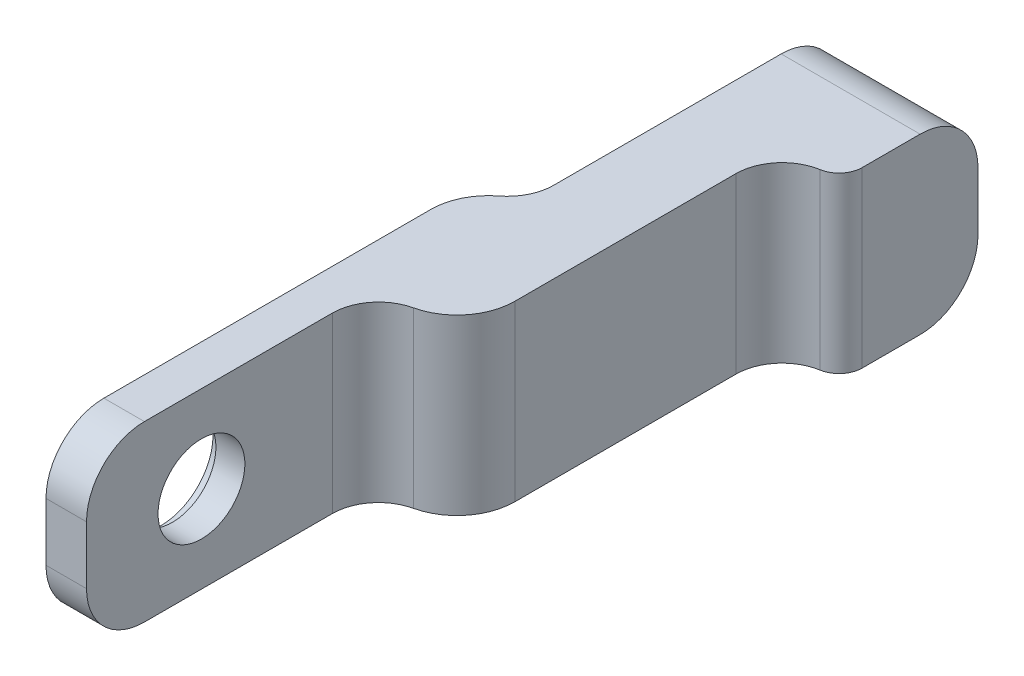
ISO-10303-21;
HEADER;
FILE_DESCRIPTION(('STEP AP214'),'2;1');
FILE_NAME('part.step','',(''),(''),'','','');
FILE_SCHEMA(('AUTOMOTIVE_DESIGN { 1 0 10303 214 1 1 1 1 }'));
ENDSEC;
DATA;
#1=APPLICATION_CONTEXT('core data for automotive mechanical design processes');
#2=APPLICATION_PROTOCOL_DEFINITION('international standard','automotive_design',2000,#1);
#3=PRODUCT_CONTEXT('',#1,'mechanical');
#4=PRODUCT('Part','Part','',(#3));
#5=PRODUCT_RELATED_PRODUCT_CATEGORY('part','',(#4));
#6=PRODUCT_DEFINITION_FORMATION('','',#4);
#7=PRODUCT_DEFINITION_CONTEXT('part definition',#1,'design');
#8=PRODUCT_DEFINITION('design','',#6,#7);
#9=PRODUCT_DEFINITION_SHAPE('','',#8);
#10=(LENGTH_UNIT() NAMED_UNIT(*) SI_UNIT(.MILLI.,.METRE.));
#11=(NAMED_UNIT(*) PLANE_ANGLE_UNIT() SI_UNIT($,.RADIAN.));
#12=(NAMED_UNIT(*) SI_UNIT($,.STERADIAN.) SOLID_ANGLE_UNIT());
#13=UNCERTAINTY_MEASURE_WITH_UNIT(LENGTH_MEASURE(1.E-05),#10,'distance_accuracy_value','');
#14=(GEOMETRIC_REPRESENTATION_CONTEXT(3) GLOBAL_UNCERTAINTY_ASSIGNED_CONTEXT((#13)) GLOBAL_UNIT_ASSIGNED_CONTEXT((#10,
#11,#12)) REPRESENTATION_CONTEXT('',''));
#15=CARTESIAN_POINT('',(0.,0.,0.));
#16=DIRECTION('',(0.,0.,1.));
#17=DIRECTION('',(1.,0.,0.));
#18=AXIS2_PLACEMENT_3D('',#15,#16,#17);
#19=CARTESIAN_POINT('',(12.,-4.,0.));
#20=DIRECTION('',(-1.,0.,0.));
#21=DIRECTION('',(0.,0.,1.));
#22=AXIS2_PLACEMENT_3D('',#19,#20,#21);
#23=PLANE('',#22);
#24=DIRECTION('',(0.,0.,1.));
#25=VECTOR('',#24,1.);
#26=CARTESIAN_POINT('',(12.,11.,0.));
#27=LINE('',#26,#25);
#28=CARTESIAN_POINT('',(12.,11.,0.));
#29=VERTEX_POINT('',#28);
#30=CARTESIAN_POINT('',(12.,11.,5.));
#31=VERTEX_POINT('',#30);
#32=EDGE_CURVE('E255',#29,#31,#27,.T.);
#33=ORIENTED_EDGE('',*,*,#32,.T.);
#34=DIRECTION('',(0.,1.,0.));
#35=VECTOR('',#34,1.);
#36=CARTESIAN_POINT('',(12.,-4.,5.));
#37=LINE('',#36,#35);
#38=CARTESIAN_POINT('',(12.,-4.,5.));
#39=VERTEX_POINT('',#38);
#40=EDGE_CURVE('E347',#31,#39,#37,.F.);
#41=ORIENTED_EDGE('',*,*,#40,.T.);
#42=DIRECTION('',(0.,0.,1.));
#43=VECTOR('',#42,1.);
#44=CARTESIAN_POINT('',(12.,-4.,0.));
#45=LINE('',#44,#43);
#46=CARTESIAN_POINT('',(12.,-4.,0.));
#47=VERTEX_POINT('',#46);
#48=EDGE_CURVE('E268',#47,#39,#45,.T.);
#49=ORIENTED_EDGE('',*,*,#48,.F.);
#50=CARTESIAN_POINT('',(12.,1.,0.));
#51=DIRECTION('',(-1.,0.,0.));
#52=DIRECTION('',(0.,0.,1.));
#53=AXIS2_PLACEMENT_3D('',#50,#51,#52);
#54=CIRCLE('',#53,5.);
#55=CARTESIAN_POINT('',(12.,1.,-5.));
#56=VERTEX_POINT('',#55);
#57=EDGE_CURVE('E302',#47,#56,#54,.F.);
#58=ORIENTED_EDGE('',*,*,#57,.T.);
#59=DIRECTION('',(0.,1.,0.));
#60=VECTOR('',#59,1.);
#61=CARTESIAN_POINT('',(12.,-4.,-5.));
#62=LINE('',#61,#60);
#63=CARTESIAN_POINT('',(12.,6.,-5.));
#64=VERTEX_POINT('',#63);
#65=EDGE_CURVE('E282',#56,#64,#62,.T.);
#66=ORIENTED_EDGE('',*,*,#65,.T.);
#67=CARTESIAN_POINT('',(12.,6.,0.));
#68=DIRECTION('',(-1.,0.,0.));
#69=DIRECTION('',(0.,0.,1.));
#70=AXIS2_PLACEMENT_3D('',#67,#68,#69);
#71=CIRCLE('',#70,5.);
#72=EDGE_CURVE('E300',#64,#29,#71,.F.);
#73=ORIENTED_EDGE('',*,*,#72,.T.);
#74=EDGE_LOOP('',(#33,#41,#49,#58,#66,#73));
#75=FACE_BOUND('',#74,.T.);
#76=ADVANCED_FACE('F53',(#75),#23,.F.);
#77=CARTESIAN_POINT('',(7.,-4.,0.));
#78=DIRECTION('',(1.,0.,0.));
#79=DIRECTION('',(0.,0.,-1.));
#80=AXIS2_PLACEMENT_3D('',#77,#78,#79);
#81=PLANE('',#80);
#82=DIRECTION('',(0.,0.,-1.));
#83=VECTOR('',#82,1.);
#84=CARTESIAN_POINT('',(7.,-4.,0.));
#85=LINE('',#84,#83);
#86=CARTESIAN_POINT('',(7.,-4.,30.));
#87=VERTEX_POINT('',#86);
#88=CARTESIAN_POINT('',(7.,-4.,10.9160797830996));
#89=VERTEX_POINT('',#88);
#90=EDGE_CURVE('E279',#87,#89,#85,.T.);
#91=ORIENTED_EDGE('',*,*,#90,.T.);
#92=DIRECTION('',(0.,-1.,0.));
#93=VECTOR('',#92,1.);
#94=CARTESIAN_POINT('',(7.,11.,10.9160797830996));
#95=LINE('',#94,#93);
#96=CARTESIAN_POINT('',(7.,11.,10.9160797830996));
#97=VERTEX_POINT('',#96);
#98=EDGE_CURVE('E352',#89,#97,#95,.F.);
#99=ORIENTED_EDGE('',*,*,#98,.T.);
#100=DIRECTION('',(0.,0.,-1.));
#101=VECTOR('',#100,1.);
#102=CARTESIAN_POINT('',(7.,11.,0.));
#103=LINE('',#102,#101);
#104=CARTESIAN_POINT('',(7.,11.,30.));
#105=VERTEX_POINT('',#104);
#106=EDGE_CURVE('E265',#105,#97,#103,.T.);
#107=ORIENTED_EDGE('',*,*,#106,.F.);
#108=DIRECTION('',(0.,1.,0.));
#109=VECTOR('',#108,1.);
#110=CARTESIAN_POINT('',(7.,-4.,30.));
#111=LINE('',#110,#109);
#112=EDGE_CURVE('E340',#105,#87,#111,.F.);
#113=ORIENTED_EDGE('',*,*,#112,.T.);
#114=EDGE_LOOP('',(#91,#99,#107,#113));
#115=FACE_BOUND('',#114,.T.);
#116=ADVANCED_FACE('F408',(#115),#81,.T.);
#117=CARTESIAN_POINT('',(0.,-4.,0.));
#118=DIRECTION('',(1.,0.,0.));
#119=DIRECTION('',(0.,0.,-1.));
#120=AXIS2_PLACEMENT_3D('',#117,#118,#119);
#121=PLANE('',#120);
#122=CARTESIAN_POINT('',(0.,3.5,50.0749778242976));
#123=DIRECTION('',(1.,0.,0.));
#124=DIRECTION('',(0.,0.,-1.));
#125=AXIS2_PLACEMENT_3D('',#122,#123,#124);
#126=CIRCLE('',#125,3.75000000000001);
#127=CARTESIAN_POINT('',(0.,3.5,53.8249778242977));
#128=VERTEX_POINT('',#127);
#129=EDGE_CURVE('E234',#128,#128,#126,.F.);
#130=ORIENTED_EDGE('',*,*,#129,.T.);
#131=EDGE_LOOP('',(#130));
#132=FACE_BOUND('',#131,.T.);
#133=DIRECTION('',(0.,0.,-1.));
#134=VECTOR('',#133,1.);
#135=CARTESIAN_POINT('',(0.,-4.,0.));
#136=LINE('',#135,#134);
#137=CARTESIAN_POINT('',(0.,-4.,55.));
#138=VERTEX_POINT('',#137);
#139=CARTESIAN_POINT('',(0.,-4.,38.7749643873921));
#140=VERTEX_POINT('',#139);
#141=EDGE_CURVE('E276',#138,#140,#136,.T.);
#142=ORIENTED_EDGE('',*,*,#141,.T.);
#143=DIRECTION('',(0.,-1.,0.));
#144=VECTOR('',#143,1.);
#145=CARTESIAN_POINT('',(0.,11.,38.7749643873921));
#146=LINE('',#145,#144);
#147=CARTESIAN_POINT('',(0.,11.,38.7749643873921));
#148=VERTEX_POINT('',#147);
#149=EDGE_CURVE('E357',#140,#148,#146,.F.);
#150=ORIENTED_EDGE('',*,*,#149,.T.);
#151=DIRECTION('',(0.,0.,-1.));
#152=VECTOR('',#151,1.);
#153=CARTESIAN_POINT('',(0.,11.,0.));
#154=LINE('',#153,#152);
#155=CARTESIAN_POINT('',(0.,11.,55.));
#156=VERTEX_POINT('',#155);
#157=EDGE_CURVE('E262',#156,#148,#154,.T.);
#158=ORIENTED_EDGE('',*,*,#157,.F.);
#159=CARTESIAN_POINT('',(0.,6.,55.));
#160=DIRECTION('',(1.,0.,0.));
#161=DIRECTION('',(0.,0.,-1.));
#162=AXIS2_PLACEMENT_3D('',#159,#160,#161);
#163=CIRCLE('',#162,5.);
#164=CARTESIAN_POINT('',(0.,6.,60.));
#165=VERTEX_POINT('',#164);
#166=EDGE_CURVE('E323',#156,#165,#163,.T.);
#167=ORIENTED_EDGE('',*,*,#166,.T.);
#168=DIRECTION('',(0.,1.,0.));
#169=VECTOR('',#168,1.);
#170=CARTESIAN_POINT('',(0.,-4.,60.));
#171=LINE('',#170,#169);
#172=CARTESIAN_POINT('',(0.,1.,60.));
#173=VERTEX_POINT('',#172);
#174=EDGE_CURVE('E283',#173,#165,#171,.T.);
#175=ORIENTED_EDGE('',*,*,#174,.F.);
#176=CARTESIAN_POINT('',(0.,1.,55.));
#177=DIRECTION('',(1.,0.,0.));
#178=DIRECTION('',(0.,0.,-1.));
#179=AXIS2_PLACEMENT_3D('',#176,#177,#178);
#180=CIRCLE('',#179,5.);
#181=EDGE_CURVE('E325',#173,#138,#180,.T.);
#182=ORIENTED_EDGE('',*,*,#181,.T.);
#183=EDGE_LOOP('',(#142,#150,#158,#167,#175,#182));
#184=FACE_BOUND('',#183,.T.);
#185=ADVANCED_FACE('F414',(#132,#184),#121,.T.);
#186=CARTESIAN_POINT('',(0.,-4.,60.));
#187=DIRECTION('',(0.,0.,1.));
#188=DIRECTION('',(1.,0.,0.));
#189=AXIS2_PLACEMENT_3D('',#186,#187,#188);
#190=PLANE('',#189);
#191=DIRECTION('',(0.,1.,0.));
#192=VECTOR('',#191,1.);
#193=CARTESIAN_POINT('',(-3.5,-4.,60.));
#194=LINE('',#193,#192);
#195=CARTESIAN_POINT('',(-3.5,1.,60.));
#196=VERTEX_POINT('',#195);
#197=CARTESIAN_POINT('',(-3.5,6.,60.));
#198=VERTEX_POINT('',#197);
#199=EDGE_CURVE('E287',#196,#198,#194,.T.);
#200=ORIENTED_EDGE('',*,*,#199,.F.);
#201=DIRECTION('',(1.,0.,0.));
#202=VECTOR('',#201,1.);
#203=CARTESIAN_POINT('',(0.,1.,60.));
#204=LINE('',#203,#202);
#205=EDGE_CURVE('E320',#196,#173,#204,.T.);
#206=ORIENTED_EDGE('',*,*,#205,.T.);
#207=ORIENTED_EDGE('',*,*,#174,.T.);
#208=DIRECTION('',(1.,0.,0.));
#209=VECTOR('',#208,1.);
#210=CARTESIAN_POINT('',(0.,6.,60.));
#211=LINE('',#210,#209);
#212=EDGE_CURVE('E318',#165,#198,#211,.F.);
#213=ORIENTED_EDGE('',*,*,#212,.T.);
#214=EDGE_LOOP('',(#200,#206,#207,#213));
#215=FACE_BOUND('',#214,.T.);
#216=ADVANCED_FACE('F469',(#215),#190,.T.);
#217=CARTESIAN_POINT('',(-3.5,-4.,0.));
#218=DIRECTION('',(-1.,0.,0.));
#219=DIRECTION('',(0.,0.,1.));
#220=AXIS2_PLACEMENT_3D('',#217,#218,#219);
#221=PLANE('',#220);
#222=DIRECTION('',(0.,0.,-1.));
#223=VECTOR('',#222,1.);
#224=CARTESIAN_POINT('',(-3.5,5.,0.));
#225=LINE('',#224,#223);
#226=CARTESIAN_POINT('',(-3.5,5.,42.8249778242977));
#227=VERTEX_POINT('',#226);
#228=CARTESIAN_POINT('',(-3.5,5.,41.9624874545037));
#229=VERTEX_POINT('',#228);
#230=EDGE_CURVE('E202',#227,#229,#225,.T.);
#231=ORIENTED_EDGE('',*,*,#230,.F.);
#232=DIRECTION('',(0.,1.,0.));
#233=VECTOR('',#232,1.);
#234=CARTESIAN_POINT('',(-3.5,0.,42.8249778242977));
#235=LINE('',#234,#233);
#236=CARTESIAN_POINT('',(-3.5,2.,42.8249778242977));
#237=VERTEX_POINT('',#236);
#238=EDGE_CURVE('E219',#237,#227,#235,.T.);
#239=ORIENTED_EDGE('',*,*,#238,.F.);
#240=DIRECTION('',(0.,0.,-1.));
#241=VECTOR('',#240,1.);
#242=CARTESIAN_POINT('',(-3.5,2.,0.));
#243=LINE('',#242,#241);
#244=CARTESIAN_POINT('',(-3.5,2.,41.9624874545037));
#245=VERTEX_POINT('',#244);
#246=EDGE_CURVE('E222',#237,#245,#243,.T.);
#247=ORIENTED_EDGE('',*,*,#246,.T.);
#248=CARTESIAN_POINT('',(-3.5,3.5,50.0749778242976));
#249=DIRECTION('',(-1.,0.,0.));
#250=DIRECTION('',(0.,0.,1.));
#251=AXIS2_PLACEMENT_3D('',#248,#249,#250);
#252=CIRCLE('',#251,8.25);
#253=EDGE_CURVE('E228',#229,#245,#252,.T.);
#254=ORIENTED_EDGE('',*,*,#253,.F.);
#255=EDGE_LOOP('',(#231,#239,#247,#254));
#256=FACE_BOUND('',#255,.T.);
#257=CARTESIAN_POINT('',(-3.5,3.5,50.0749778242976));
#258=DIRECTION('',(1.,0.,0.));
#259=DIRECTION('',(0.,0.,-1.));
#260=AXIS2_PLACEMENT_3D('',#257,#258,#259);
#261=CIRCLE('',#260,4.5);
#262=CARTESIAN_POINT('',(-3.5,3.5,45.5749778242977));
#263=VERTEX_POINT('',#262);
#264=EDGE_CURVE('E241',#263,#263,#261,.T.);
#265=ORIENTED_EDGE('',*,*,#264,.T.);
#266=EDGE_LOOP('',(#265));
#267=FACE_BOUND('',#266,.T.);
#268=DIRECTION('',(0.,0.,1.));
#269=VECTOR('',#268,1.);
#270=CARTESIAN_POINT('',(-3.5,11.,0.));
#271=LINE('',#270,#269);
#272=CARTESIAN_POINT('',(-3.5,11.,26.7696960070847));
#273=VERTEX_POINT('',#272);
#274=CARTESIAN_POINT('',(-3.5,11.,55.));
#275=VERTEX_POINT('',#274);
#276=EDGE_CURVE('E260',#273,#275,#271,.T.);
#277=ORIENTED_EDGE('',*,*,#276,.F.);
#278=DIRECTION('',(0.,-1.,0.));
#279=VECTOR('',#278,1.);
#280=CARTESIAN_POINT('',(-3.5,-4.,26.7696960070847));
#281=LINE('',#280,#279);
#282=CARTESIAN_POINT('',(-3.5,-4.,26.7696960070847));
#283=VERTEX_POINT('',#282);
#284=EDGE_CURVE('E334',#273,#283,#281,.T.);
#285=ORIENTED_EDGE('',*,*,#284,.T.);
#286=DIRECTION('',(0.,0.,1.));
#287=VECTOR('',#286,1.);
#288=CARTESIAN_POINT('',(-3.5,-4.,0.));
#289=LINE('',#288,#287);
#290=CARTESIAN_POINT('',(-3.5,-4.,55.));
#291=VERTEX_POINT('',#290);
#292=EDGE_CURVE('E274',#283,#291,#289,.T.);
#293=ORIENTED_EDGE('',*,*,#292,.T.);
#294=CARTESIAN_POINT('',(-3.5,1.,55.));
#295=DIRECTION('',(-1.,0.,0.));
#296=DIRECTION('',(0.,0.,1.));
#297=AXIS2_PLACEMENT_3D('',#294,#295,#296);
#298=CIRCLE('',#297,5.);
#299=EDGE_CURVE('E330',#291,#196,#298,.T.);
#300=ORIENTED_EDGE('',*,*,#299,.T.);
#301=ORIENTED_EDGE('',*,*,#199,.T.);
#302=CARTESIAN_POINT('',(-3.5,6.,55.));
#303=DIRECTION('',(-1.,0.,0.));
#304=DIRECTION('',(0.,0.,1.));
#305=AXIS2_PLACEMENT_3D('',#302,#303,#304);
#306=CIRCLE('',#305,5.);
#307=EDGE_CURVE('E327',#198,#275,#306,.T.);
#308=ORIENTED_EDGE('',*,*,#307,.T.);
#309=EDGE_LOOP('',(#277,#285,#293,#300,#301,#308));
#310=FACE_BOUND('',#309,.T.);
#311=ADVANCED_FACE('F475',(#256,#267,#310),#221,.T.);
#312=CARTESIAN_POINT('',(0.,-4.,0.));
#313=DIRECTION('',(-1.,0.,0.));
#314=DIRECTION('',(0.,0.,1.));
#315=AXIS2_PLACEMENT_3D('',#312,#313,#314);
#316=PLANE('',#315);
#317=CARTESIAN_POINT('',(0.,3.5,3.5));
#318=DIRECTION('',(1.,0.,0.));
#319=DIRECTION('',(0.,0.,-1.));
#320=AXIS2_PLACEMENT_3D('',#317,#318,#319);
#321=CIRCLE('',#320,3.25);
#322=CARTESIAN_POINT('',(0.,3.5,0.25));
#323=VERTEX_POINT('',#322);
#324=EDGE_CURVE('E249',#323,#323,#321,.T.);
#325=ORIENTED_EDGE('',*,*,#324,.T.);
#326=EDGE_LOOP('',(#325));
#327=FACE_BOUND('',#326,.T.);
#328=DIRECTION('',(0.,0.,1.));
#329=VECTOR('',#328,1.);
#330=CARTESIAN_POINT('',(0.,-4.,0.));
#331=LINE('',#330,#329);
#332=CARTESIAN_POINT('',(0.,-4.,0.));
#333=VERTEX_POINT('',#332);
#334=CARTESIAN_POINT('',(0.,-4.,19.6457925826972));
#335=VERTEX_POINT('',#334);
#336=EDGE_CURVE('E271',#333,#335,#331,.T.);
#337=ORIENTED_EDGE('',*,*,#336,.T.);
#338=DIRECTION('',(0.,-1.,0.));
#339=VECTOR('',#338,1.);
#340=CARTESIAN_POINT('',(0.,11.,19.6457925826972));
#341=LINE('',#340,#339);
#342=CARTESIAN_POINT('',(0.,11.,19.6457925826972));
#343=VERTEX_POINT('',#342);
#344=EDGE_CURVE('E370',#335,#343,#341,.F.);
#345=ORIENTED_EDGE('',*,*,#344,.T.);
#346=DIRECTION('',(0.,0.,1.));
#347=VECTOR('',#346,1.);
#348=CARTESIAN_POINT('',(0.,11.,0.));
#349=LINE('',#348,#347);
#350=CARTESIAN_POINT('',(0.,11.,0.));
#351=VERTEX_POINT('',#350);
#352=EDGE_CURVE('E258',#351,#343,#349,.T.);
#353=ORIENTED_EDGE('',*,*,#352,.F.);
#354=CARTESIAN_POINT('',(0.,6.,0.));
#355=DIRECTION('',(-1.,0.,0.));
#356=DIRECTION('',(0.,0.,1.));
#357=AXIS2_PLACEMENT_3D('',#354,#355,#356);
#358=CIRCLE('',#357,5.);
#359=CARTESIAN_POINT('',(0.,6.,-5.));
#360=VERTEX_POINT('',#359);
#361=EDGE_CURVE('E309',#351,#360,#358,.T.);
#362=ORIENTED_EDGE('',*,*,#361,.T.);
#363=DIRECTION('',(0.,1.,0.));
#364=VECTOR('',#363,1.);
#365=CARTESIAN_POINT('',(0.,-4.,-5.));
#366=LINE('',#365,#364);
#367=CARTESIAN_POINT('',(0.,1.,-5.));
#368=VERTEX_POINT('',#367);
#369=EDGE_CURVE('E290',#368,#360,#366,.T.);
#370=ORIENTED_EDGE('',*,*,#369,.F.);
#371=CARTESIAN_POINT('',(0.,1.,0.));
#372=DIRECTION('',(-1.,0.,0.));
#373=DIRECTION('',(0.,0.,1.));
#374=AXIS2_PLACEMENT_3D('',#371,#372,#373);
#375=CIRCLE('',#374,5.);
#376=EDGE_CURVE('E311',#368,#333,#375,.T.);
#377=ORIENTED_EDGE('',*,*,#376,.T.);
#378=EDGE_LOOP('',(#337,#345,#353,#362,#370,#377));
#379=FACE_BOUND('',#378,.T.);
#380=ADVANCED_FACE('F376',(#327,#379),#316,.T.);
#381=CARTESIAN_POINT('',(0.,-4.,-5.));
#382=DIRECTION('',(0.,0.,1.));
#383=DIRECTION('',(1.,0.,0.));
#384=AXIS2_PLACEMENT_3D('',#381,#382,#383);
#385=PLANE('',#384);
#386=ORIENTED_EDGE('',*,*,#65,.F.);
#387=DIRECTION('',(1.,0.,0.));
#388=VECTOR('',#387,1.);
#389=CARTESIAN_POINT('',(0.,1.,-5.));
#390=LINE('',#389,#388);
#391=EDGE_CURVE('E307',#56,#368,#390,.F.);
#392=ORIENTED_EDGE('',*,*,#391,.T.);
#393=ORIENTED_EDGE('',*,*,#369,.T.);
#394=DIRECTION('',(1.,0.,0.));
#395=VECTOR('',#394,1.);
#396=CARTESIAN_POINT('',(12.,6.,-5.));
#397=LINE('',#396,#395);
#398=EDGE_CURVE('E304',#360,#64,#397,.T.);
#399=ORIENTED_EDGE('',*,*,#398,.T.);
#400=EDGE_LOOP('',(#386,#392,#393,#399));
#401=FACE_BOUND('',#400,.T.);
#402=ADVANCED_FACE('F391',(#401),#385,.F.);
#403=CARTESIAN_POINT('',(0.,-4.,0.));
#404=DIRECTION('',(0.,1.,0.));
#405=DIRECTION('',(0.,0.,1.));
#406=AXIS2_PLACEMENT_3D('',#403,#404,#405);
#407=PLANE('',#406);
#408=ORIENTED_EDGE('',*,*,#48,.T.);
#409=CARTESIAN_POINT('',(10.,-4.,5.));
#410=DIRECTION('',(0.,1.,0.));
#411=DIRECTION('',(0.,0.,1.));
#412=AXIS2_PLACEMENT_3D('',#409,#410,#411);
#413=CIRCLE('',#412,2.);
#414=CARTESIAN_POINT('',(10.3333333333333,-4.,6.97202659436654));
#415=VERTEX_POINT('',#414);
#416=EDGE_CURVE('E349',#39,#415,#413,.F.);
#417=ORIENTED_EDGE('',*,*,#416,.T.);
#418=CARTESIAN_POINT('',(11.,-4.,10.9160797830996));
#419=DIRECTION('',(0.,1.,0.));
#420=DIRECTION('',(0.,0.,1.));
#421=AXIS2_PLACEMENT_3D('',#418,#419,#420);
#422=CIRCLE('',#421,4.);
#423=EDGE_CURVE('E364',#415,#89,#422,.T.);
#424=ORIENTED_EDGE('',*,*,#423,.T.);
#425=ORIENTED_EDGE('',*,*,#90,.F.);
#426=CARTESIAN_POINT('',(2.,-4.,30.));
#427=DIRECTION('',(0.,1.,0.));
#428=DIRECTION('',(0.,0.,1.));
#429=AXIS2_PLACEMENT_3D('',#426,#427,#428);
#430=CIRCLE('',#429,5.);
#431=CARTESIAN_POINT('',(3.11111111111111,-4.,34.8749802152178));
#432=VERTEX_POINT('',#431);
#433=EDGE_CURVE('E342',#87,#432,#430,.F.);
#434=ORIENTED_EDGE('',*,*,#433,.T.);
#435=CARTESIAN_POINT('',(4.,-4.,38.7749643873921));
#436=DIRECTION('',(0.,1.,0.));
#437=DIRECTION('',(0.,0.,1.));
#438=AXIS2_PLACEMENT_3D('',#435,#436,#437);
#439=CIRCLE('',#438,4.);
#440=EDGE_CURVE('E368',#432,#140,#439,.T.);
#441=ORIENTED_EDGE('',*,*,#440,.T.);
#442=ORIENTED_EDGE('',*,*,#141,.F.);
#443=DIRECTION('',(1.,0.,0.));
#444=VECTOR('',#443,1.);
#445=CARTESIAN_POINT('',(-3.5,-4.,55.));
#446=LINE('',#445,#444);
#447=EDGE_CURVE('E286',#138,#291,#446,.F.);
#448=ORIENTED_EDGE('',*,*,#447,.T.);
#449=ORIENTED_EDGE('',*,*,#292,.F.);
#450=CARTESIAN_POINT('',(1.5,-4.,26.7696960070847));
#451=DIRECTION('',(0.,1.,0.));
#452=DIRECTION('',(0.,0.,1.));
#453=AXIS2_PLACEMENT_3D('',#450,#451,#452);
#454=CIRCLE('',#453,5.);
#455=CARTESIAN_POINT('',(-1.55555555555555,-4.,22.811971882425));
#456=VERTEX_POINT('',#455);
#457=EDGE_CURVE('E336',#283,#456,#454,.F.);
#458=ORIENTED_EDGE('',*,*,#457,.T.);
#459=CARTESIAN_POINT('',(-4.,-4.,19.6457925826972));
#460=DIRECTION('',(0.,1.,0.));
#461=DIRECTION('',(0.,0.,1.));
#462=AXIS2_PLACEMENT_3D('',#459,#460,#461);
#463=CIRCLE('',#462,4.);
#464=EDGE_CURVE('E12',#456,#335,#463,.T.);
#465=ORIENTED_EDGE('',*,*,#464,.T.);
#466=ORIENTED_EDGE('',*,*,#336,.F.);
#467=DIRECTION('',(1.,0.,0.));
#468=VECTOR('',#467,1.);
#469=CARTESIAN_POINT('',(0.,-4.,0.));
#470=LINE('',#469,#468);
#471=EDGE_CURVE('E297',#333,#47,#470,.T.);
#472=ORIENTED_EDGE('',*,*,#471,.T.);
#473=EDGE_LOOP('',(#408,#417,#424,#425,#434,#441,#442,#448,#449,#458,#465,#466,#472));
#474=FACE_BOUND('',#473,.T.);
#475=ADVANCED_FACE('F397',(#474),#407,.F.);
#476=CARTESIAN_POINT('',(0.,11.,0.));
#477=DIRECTION('',(0.,1.,0.));
#478=DIRECTION('',(0.,0.,1.));
#479=AXIS2_PLACEMENT_3D('',#476,#477,#478);
#480=PLANE('',#479);
#481=ORIENTED_EDGE('',*,*,#106,.T.);
#482=CARTESIAN_POINT('',(11.,11.,10.9160797830996));
#483=DIRECTION('',(0.,1.,0.));
#484=DIRECTION('',(0.,0.,1.));
#485=AXIS2_PLACEMENT_3D('',#482,#483,#484);
#486=CIRCLE('',#485,4.);
#487=CARTESIAN_POINT('',(10.3333333333333,11.,6.97202659436654));
#488=VERTEX_POINT('',#487);
#489=EDGE_CURVE('E362',#97,#488,#486,.F.);
#490=ORIENTED_EDGE('',*,*,#489,.T.);
#491=CARTESIAN_POINT('',(10.,11.,5.));
#492=DIRECTION('',(0.,1.,0.));
#493=DIRECTION('',(0.,0.,1.));
#494=AXIS2_PLACEMENT_3D('',#491,#492,#493);
#495=CIRCLE('',#494,2.);
#496=EDGE_CURVE('E345',#488,#31,#495,.T.);
#497=ORIENTED_EDGE('',*,*,#496,.T.);
#498=ORIENTED_EDGE('',*,*,#32,.F.);
#499=DIRECTION('',(1.,0.,0.));
#500=VECTOR('',#499,1.);
#501=CARTESIAN_POINT('',(0.,11.,0.));
#502=LINE('',#501,#500);
#503=EDGE_CURVE('E316',#29,#351,#502,.F.);
#504=ORIENTED_EDGE('',*,*,#503,.T.);
#505=ORIENTED_EDGE('',*,*,#352,.T.);
#506=CARTESIAN_POINT('',(-4.,11.,19.6457925826972));
#507=DIRECTION('',(0.,1.,0.));
#508=DIRECTION('',(0.,0.,1.));
#509=AXIS2_PLACEMENT_3D('',#506,#507,#508);
#510=CIRCLE('',#509,4.);
#511=CARTESIAN_POINT('',(-1.55555555555555,11.,22.811971882425));
#512=VERTEX_POINT('',#511);
#513=EDGE_CURVE('E61',#343,#512,#510,.F.);
#514=ORIENTED_EDGE('',*,*,#513,.T.);
#515=CARTESIAN_POINT('',(1.5,11.,26.7696960070847));
#516=DIRECTION('',(0.,1.,0.));
#517=DIRECTION('',(0.,0.,1.));
#518=AXIS2_PLACEMENT_3D('',#515,#516,#517);
#519=CIRCLE('',#518,5.);
#520=EDGE_CURVE('E332',#512,#273,#519,.T.);
#521=ORIENTED_EDGE('',*,*,#520,.T.);
#522=ORIENTED_EDGE('',*,*,#276,.T.);
#523=DIRECTION('',(1.,0.,0.));
#524=VECTOR('',#523,1.);
#525=CARTESIAN_POINT('',(0.,11.,55.));
#526=LINE('',#525,#524);
#527=EDGE_CURVE('E313',#275,#156,#526,.T.);
#528=ORIENTED_EDGE('',*,*,#527,.T.);
#529=ORIENTED_EDGE('',*,*,#157,.T.);
#530=CARTESIAN_POINT('',(4.,11.,38.7749643873921));
#531=DIRECTION('',(0.,1.,0.));
#532=DIRECTION('',(0.,0.,1.));
#533=AXIS2_PLACEMENT_3D('',#530,#531,#532);
#534=CIRCLE('',#533,4.);
#535=CARTESIAN_POINT('',(3.11111111111111,11.,34.8749802152178));
#536=VERTEX_POINT('',#535);
#537=EDGE_CURVE('E366',#148,#536,#534,.F.);
#538=ORIENTED_EDGE('',*,*,#537,.T.);
#539=CARTESIAN_POINT('',(2.,11.,30.));
#540=DIRECTION('',(0.,1.,0.));
#541=DIRECTION('',(0.,0.,1.));
#542=AXIS2_PLACEMENT_3D('',#539,#540,#541);
#543=CIRCLE('',#542,5.);
#544=EDGE_CURVE('E338',#536,#105,#543,.T.);
#545=ORIENTED_EDGE('',*,*,#544,.T.);
#546=EDGE_LOOP('',(#481,#490,#497,#498,#504,#505,#514,#521,#522,#528,#529,#538,#545));
#547=FACE_BOUND('',#546,.T.);
#548=ADVANCED_FACE('F381',(#547),#480,.T.);
#549=CARTESIAN_POINT('',(10.,0.,0.));
#550=DIRECTION('',(1.,0.,0.));
#551=DIRECTION('',(0.,0.,-1.));
#552=AXIS2_PLACEMENT_3D('',#549,#550,#551);
#553=PLANE('',#552);
#554=CARTESIAN_POINT('',(10.,3.5,3.5));
#555=DIRECTION('',(1.,0.,0.));
#556=DIRECTION('',(0.,0.,-1.));
#557=AXIS2_PLACEMENT_3D('',#554,#555,#556);
#558=CIRCLE('',#557,3.25);
#559=CARTESIAN_POINT('',(10.,3.5,0.249999999999998));
#560=VERTEX_POINT('',#559);
#561=EDGE_CURVE('E252',#560,#560,#558,.T.);
#562=ORIENTED_EDGE('',*,*,#561,.F.);
#563=EDGE_LOOP('',(#562));
#564=FACE_BOUND('',#563,.T.);
#565=ADVANCED_FACE('F494',(#564),#553,.F.);
#566=CARTESIAN_POINT('',(0.,3.5,3.5));
#567=DIRECTION('',(1.,0.,0.));
#568=DIRECTION('',(0.,0.,-1.));
#569=AXIS2_PLACEMENT_3D('',#566,#567,#568);
#570=CYLINDRICAL_SURFACE('',#569,3.25);
#571=ORIENTED_EDGE('',*,*,#324,.F.);
#572=EDGE_LOOP('',(#571));
#573=FACE_BOUND('',#572,.T.);
#574=ORIENTED_EDGE('',*,*,#561,.T.);
#575=EDGE_LOOP('',(#574));
#576=FACE_BOUND('',#575,.T.);
#577=ADVANCED_FACE('F495',(#573,#576),#570,.F.);
#578=CARTESIAN_POINT('',(-2.5,0.,0.));
#579=DIRECTION('',(1.,0.,0.));
#580=DIRECTION('',(0.,0.,-1.));
#581=AXIS2_PLACEMENT_3D('',#578,#579,#580);
#582=PLANE('',#581);
#583=CARTESIAN_POINT('',(-2.5,3.5,50.0749778242976));
#584=DIRECTION('',(-1.,0.,0.));
#585=DIRECTION('',(0.,0.,1.));
#586=AXIS2_PLACEMENT_3D('',#583,#584,#585);
#587=CIRCLE('',#586,3.75000000000001);
#588=CARTESIAN_POINT('',(-2.5,3.5,53.8249778242977));
#589=VERTEX_POINT('',#588);
#590=EDGE_CURVE('E238',#589,#589,#587,.T.);
#591=ORIENTED_EDGE('',*,*,#590,.F.);
#592=EDGE_LOOP('',(#591));
#593=FACE_BOUND('',#592,.T.);
#594=CARTESIAN_POINT('',(-2.5,3.5,50.0749778242976));
#595=DIRECTION('',(1.,0.,0.));
#596=DIRECTION('',(0.,0.,-1.));
#597=AXIS2_PLACEMENT_3D('',#594,#595,#596);
#598=CIRCLE('',#597,4.5);
#599=CARTESIAN_POINT('',(-2.5,3.5,45.5749778242977));
#600=VERTEX_POINT('',#599);
#601=EDGE_CURVE('E246',#600,#600,#598,.T.);
#602=ORIENTED_EDGE('',*,*,#601,.F.);
#603=EDGE_LOOP('',(#602));
#604=FACE_BOUND('',#603,.T.);
#605=ADVANCED_FACE('F502',(#593,#604),#582,.F.);
#606=CARTESIAN_POINT('',(-3.5,3.5,50.0749778242976));
#607=DIRECTION('',(1.,0.,0.));
#608=DIRECTION('',(0.,0.,-1.));
#609=AXIS2_PLACEMENT_3D('',#606,#607,#608);
#610=CYLINDRICAL_SURFACE('',#609,4.5);
#611=ORIENTED_EDGE('',*,*,#264,.F.);
#612=EDGE_LOOP('',(#611));
#613=FACE_BOUND('',#612,.T.);
#614=ORIENTED_EDGE('',*,*,#601,.T.);
#615=EDGE_LOOP('',(#614));
#616=FACE_BOUND('',#615,.T.);
#617=ADVANCED_FACE('F499',(#613,#616),#610,.F.);
#618=CARTESIAN_POINT('',(12.001,3.5,50.0749778242976));
#619=DIRECTION('',(-1.,0.,0.));
#620=DIRECTION('',(0.,0.,1.));
#621=AXIS2_PLACEMENT_3D('',#618,#619,#620);
#622=CYLINDRICAL_SURFACE('',#621,3.75000000000001);
#623=CARTESIAN_POINT('',(0.,3.5,53.8249778242977));
#624=CARTESIAN_POINT('',(-0.0260416666666667,3.5,53.8249778242977));
#625=CARTESIAN_POINT('',(-0.0520833333333334,3.5,53.8249778242977));
#626=CARTESIAN_POINT('',(-0.104166666666667,3.5,53.8249778242977));
#627=CARTESIAN_POINT('',(-0.130208333333333,3.5,53.8249778242977));
#628=CARTESIAN_POINT('',(-0.182291666666667,3.5,53.8249778242977));
#629=CARTESIAN_POINT('',(-0.208333333333334,3.5,53.8249778242977));
#630=CARTESIAN_POINT('',(-0.260416666666667,3.5,53.8249778242977));
#631=CARTESIAN_POINT('',(-0.286458333333334,3.5,53.8249778242977));
#632=CARTESIAN_POINT('',(-0.338541666666667,3.5,53.8249778242977));
#633=CARTESIAN_POINT('',(-0.364583333333334,3.5,53.8249778242977));
#634=CARTESIAN_POINT('',(-0.416666666666667,3.5,53.8249778242977));
#635=CARTESIAN_POINT('',(-0.442708333333334,3.5,53.8249778242977));
#636=CARTESIAN_POINT('',(-0.494791666666667,3.5,53.8249778242977));
#637=CARTESIAN_POINT('',(-0.520833333333334,3.5,53.8249778242977));
#638=CARTESIAN_POINT('',(-0.572916666666667,3.5,53.8249778242977));
#639=CARTESIAN_POINT('',(-0.598958333333334,3.5,53.8249778242977));
#640=CARTESIAN_POINT('',(-0.651041666666667,3.5,53.8249778242977));
#641=CARTESIAN_POINT('',(-0.677083333333333,3.5,53.8249778242977));
#642=CARTESIAN_POINT('',(-0.729166666666666,3.5,53.8249778242977));
#643=CARTESIAN_POINT('',(-0.755208333333332,3.5,53.8249778242977));
#644=CARTESIAN_POINT('',(-0.807291666666666,3.5,53.8249778242977));
#645=CARTESIAN_POINT('',(-0.833333333333332,3.5,53.8249778242977));
#646=CARTESIAN_POINT('',(-0.885416666666666,3.5,53.8249778242977));
#647=CARTESIAN_POINT('',(-0.911458333333332,3.5,53.8249778242977));
#648=CARTESIAN_POINT('',(-0.963541666666666,3.5,53.8249778242977));
#649=CARTESIAN_POINT('',(-0.989583333333333,3.5,53.8249778242977));
#650=CARTESIAN_POINT('',(-1.04166666666667,3.5,53.8249778242977));
#651=CARTESIAN_POINT('',(-1.06770833333333,3.5,53.8249778242977));
#652=CARTESIAN_POINT('',(-1.11979166666667,3.5,53.8249778242977));
#653=CARTESIAN_POINT('',(-1.14583333333333,3.5,53.8249778242977));
#654=CARTESIAN_POINT('',(-1.19791666666667,3.5,53.8249778242977));
#655=CARTESIAN_POINT('',(-1.22395833333333,3.5,53.8249778242977));
#656=CARTESIAN_POINT('',(-1.27604166666667,3.5,53.8249778242977));
#657=CARTESIAN_POINT('',(-1.30208333333333,3.5,53.8249778242977));
#658=CARTESIAN_POINT('',(-1.35416666666667,3.5,53.8249778242977));
#659=CARTESIAN_POINT('',(-1.38020833333333,3.5,53.8249778242977));
#660=CARTESIAN_POINT('',(-1.43229166666667,3.5,53.8249778242977));
#661=CARTESIAN_POINT('',(-1.45833333333333,3.5,53.8249778242977));
#662=CARTESIAN_POINT('',(-1.51041666666667,3.5,53.8249778242977));
#663=CARTESIAN_POINT('',(-1.53645833333333,3.5,53.8249778242977));
#664=CARTESIAN_POINT('',(-1.58854166666667,3.5,53.8249778242977));
#665=CARTESIAN_POINT('',(-1.61458333333333,3.5,53.8249778242977));
#666=CARTESIAN_POINT('',(-1.66666666666667,3.5,53.8249778242977));
#667=CARTESIAN_POINT('',(-1.69270833333333,3.5,53.8249778242977));
#668=CARTESIAN_POINT('',(-1.74479166666667,3.5,53.8249778242977));
#669=CARTESIAN_POINT('',(-1.77083333333333,3.5,53.8249778242977));
#670=CARTESIAN_POINT('',(-1.82291666666667,3.5,53.8249778242977));
#671=CARTESIAN_POINT('',(-1.84895833333333,3.5,53.8249778242977));
#672=CARTESIAN_POINT('',(-1.90104166666667,3.5,53.8249778242977));
#673=CARTESIAN_POINT('',(-1.92708333333333,3.5,53.8249778242977));
#674=CARTESIAN_POINT('',(-1.97916666666667,3.5,53.8249778242977));
#675=CARTESIAN_POINT('',(-2.00520833333333,3.5,53.8249778242977));
#676=CARTESIAN_POINT('',(-2.05729166666667,3.5,53.8249778242977));
#677=CARTESIAN_POINT('',(-2.08333333333333,3.5,53.8249778242977));
#678=CARTESIAN_POINT('',(-2.13541666666667,3.5,53.8249778242977));
#679=CARTESIAN_POINT('',(-2.16145833333333,3.5,53.8249778242977));
#680=CARTESIAN_POINT('',(-2.21354166666667,3.5,53.8249778242977));
#681=CARTESIAN_POINT('',(-2.23958333333333,3.5,53.8249778242977));
#682=CARTESIAN_POINT('',(-2.29166666666667,3.5,53.8249778242977));
#683=CARTESIAN_POINT('',(-2.31770833333333,3.5,53.8249778242977));
#684=CARTESIAN_POINT('',(-2.36979166666667,3.5,53.8249778242977));
#685=CARTESIAN_POINT('',(-2.39583333333333,3.5,53.8249778242977));
#686=CARTESIAN_POINT('',(-2.44791666666667,3.5,53.8249778242977));
#687=CARTESIAN_POINT('',(-2.47395833333333,3.5,53.8249778242977));
#688=CARTESIAN_POINT('',(-2.5,3.5,53.8249778242977));
#689=B_SPLINE_CURVE_WITH_KNOTS('',3,(#623,#624,#625,#626,#627,#628,#629,#630,#631,#632,#633,
#634,#635,#636,#637,#638,#639,#640,#641,#642,#643,#644,#645,#646,#647,#648,#649,#650,#651,#652,
#653,#654,#655,#656,#657,#658,#659,#660,#661,#662,#663,#664,#665,#666,#667,#668,#669,#670,#671,
#672,#673,#674,#675,#676,#677,#678,#679,#680,#681,#682,#683,#684,#685,#686,#687,#688),
.UNSPECIFIED.,.F.,.F.,(4,2,2,2,2,2,2,2,2,2,2,2,2,2,2,2,2,2,2,2,2,2,2,2,2,2,2,2,2,2,2,2,4),(0.,
0.0781250000000001,0.15625,0.234375,0.3125,0.390625,0.46875,0.546875,0.625000000000001,
0.703124999999999,0.781249999999999,0.859374999999999,0.937499999999999,1.015625,1.09375,
1.171875,1.25,1.328125,1.40625,1.484375,1.5625,1.640625,1.71875,1.796875,1.875,1.953125,2.03125,
2.109375,2.1875,2.265625,2.34375,2.421875,2.5),.UNSPECIFIED.);
#690=EDGE_CURVE('BSEAM507',#128,#589,#689,.T.);
#691=ORIENTED_EDGE('',*,*,#129,.F.);
#692=ORIENTED_EDGE('',*,*,#590,.T.);
#693=ORIENTED_EDGE('',*,*,#690,.T.);
#694=ORIENTED_EDGE('',*,*,#690,.F.);
#695=EDGE_LOOP('',(#691,#693,#692,#694));
#696=FACE_BOUND('',#695,.T.);
#697=ADVANCED_FACE('F507',(#696),#622,.F.);
#698=CARTESIAN_POINT('',(-1.,5.,0.));
#699=DIRECTION('',(0.,1.,0.));
#700=DIRECTION('',(0.,0.,1.));
#701=AXIS2_PLACEMENT_3D('',#698,#699,#700);
#702=PLANE('',#701);
#703=ORIENTED_EDGE('',*,*,#230,.T.);
#704=DIRECTION('',(-1.,0.,0.));
#705=VECTOR('',#704,1.);
#706=CARTESIAN_POINT('',(-1.,5.,41.9624874545037));
#707=LINE('',#706,#705);
#708=CARTESIAN_POINT('',(-1.,5.,41.9624874545037));
#709=VERTEX_POINT('',#708);
#710=EDGE_CURVE('E195',#709,#229,#707,.T.);
#711=ORIENTED_EDGE('',*,*,#710,.F.);
#712=DIRECTION('',(0.,0.,-1.));
#713=VECTOR('',#712,1.);
#714=CARTESIAN_POINT('',(-1.,5.,0.));
#715=LINE('',#714,#713);
#716=CARTESIAN_POINT('',(-1.,5.,42.8249778242977));
#717=VERTEX_POINT('',#716);
#718=EDGE_CURVE('E199',#717,#709,#715,.T.);
#719=ORIENTED_EDGE('',*,*,#718,.F.);
#720=DIRECTION('',(-1.,0.,0.));
#721=VECTOR('',#720,1.);
#722=CARTESIAN_POINT('',(-1.,5.,42.8249778242977));
#723=LINE('',#722,#721);
#724=EDGE_CURVE('E232',#717,#227,#723,.T.);
#725=ORIENTED_EDGE('',*,*,#724,.T.);
#726=EDGE_LOOP('',(#703,#711,#719,#725));
#727=FACE_BOUND('',#726,.T.);
#728=ADVANCED_FACE('F197',(#727),#702,.F.);
#729=CARTESIAN_POINT('',(-1.,0.,42.8249778242977));
#730=DIRECTION('',(0.,0.,1.));
#731=DIRECTION('',(1.,0.,0.));
#732=AXIS2_PLACEMENT_3D('',#729,#730,#731);
#733=PLANE('',#732);
#734=ORIENTED_EDGE('',*,*,#238,.T.);
#735=ORIENTED_EDGE('',*,*,#724,.F.);
#736=DIRECTION('',(0.,1.,0.));
#737=VECTOR('',#736,1.);
#738=CARTESIAN_POINT('',(-1.,0.,42.8249778242977));
#739=LINE('',#738,#737);
#740=CARTESIAN_POINT('',(-1.,2.,42.8249778242977));
#741=VERTEX_POINT('',#740);
#742=EDGE_CURVE('E207',#741,#717,#739,.T.);
#743=ORIENTED_EDGE('',*,*,#742,.F.);
#744=DIRECTION('',(-1.,0.,0.));
#745=VECTOR('',#744,1.);
#746=CARTESIAN_POINT('',(-1.,2.,42.8249778242977));
#747=LINE('',#746,#745);
#748=EDGE_CURVE('E235',#741,#237,#747,.T.);
#749=ORIENTED_EDGE('',*,*,#748,.T.);
#750=EDGE_LOOP('',(#734,#735,#743,#749));
#751=FACE_BOUND('',#750,.T.);
#752=ADVANCED_FACE('F516',(#751),#733,.F.);
#753=CARTESIAN_POINT('',(-1.,2.,0.));
#754=DIRECTION('',(0.,1.,0.));
#755=DIRECTION('',(0.,0.,1.));
#756=AXIS2_PLACEMENT_3D('',#753,#754,#755);
#757=PLANE('',#756);
#758=ORIENTED_EDGE('',*,*,#246,.F.);
#759=ORIENTED_EDGE('',*,*,#748,.F.);
#760=DIRECTION('',(0.,0.,-1.));
#761=VECTOR('',#760,1.);
#762=CARTESIAN_POINT('',(-1.,2.,0.));
#763=LINE('',#762,#761);
#764=CARTESIAN_POINT('',(-1.,2.,41.9624874545037));
#765=VERTEX_POINT('',#764);
#766=EDGE_CURVE('E215',#741,#765,#763,.T.);
#767=ORIENTED_EDGE('',*,*,#766,.T.);
#768=DIRECTION('',(-1.,0.,0.));
#769=VECTOR('',#768,1.);
#770=CARTESIAN_POINT('',(-1.,2.,41.9624874545037));
#771=LINE('',#770,#769);
#772=EDGE_CURVE('E206',#765,#245,#771,.T.);
#773=ORIENTED_EDGE('',*,*,#772,.T.);
#774=EDGE_LOOP('',(#758,#759,#767,#773));
#775=FACE_BOUND('',#774,.T.);
#776=ADVANCED_FACE('F519',(#775),#757,.T.);
#777=CARTESIAN_POINT('',(-1.,3.5,50.0749778242976));
#778=DIRECTION('',(-1.,0.,0.));
#779=DIRECTION('',(0.,0.,1.));
#780=AXIS2_PLACEMENT_3D('',#777,#778,#779);
#781=CYLINDRICAL_SURFACE('',#780,8.25);
#782=ORIENTED_EDGE('',*,*,#253,.T.);
#783=ORIENTED_EDGE('',*,*,#772,.F.);
#784=CARTESIAN_POINT('',(-1.,3.5,50.0749778242976));
#785=DIRECTION('',(-1.,0.,0.));
#786=DIRECTION('',(0.,0.,1.));
#787=AXIS2_PLACEMENT_3D('',#784,#785,#786);
#788=CIRCLE('',#787,8.25);
#789=EDGE_CURVE('E211',#709,#765,#788,.T.);
#790=ORIENTED_EDGE('',*,*,#789,.F.);
#791=ORIENTED_EDGE('',*,*,#710,.T.);
#792=EDGE_LOOP('',(#782,#783,#790,#791));
#793=FACE_BOUND('',#792,.T.);
#794=ADVANCED_FACE('F212',(#793),#781,.F.);
#795=CARTESIAN_POINT('',(-1.,0.,0.));
#796=DIRECTION('',(-1.,0.,0.));
#797=DIRECTION('',(0.,0.,1.));
#798=AXIS2_PLACEMENT_3D('',#795,#796,#797);
#799=PLANE('',#798);
#800=ORIENTED_EDGE('',*,*,#718,.T.);
#801=ORIENTED_EDGE('',*,*,#789,.T.);
#802=ORIENTED_EDGE('',*,*,#766,.F.);
#803=ORIENTED_EDGE('',*,*,#742,.T.);
#804=EDGE_LOOP('',(#800,#801,#802,#803));
#805=FACE_BOUND('',#804,.T.);
#806=ADVANCED_FACE('F217',(#805),#799,.T.);
#807=CARTESIAN_POINT('',(0.,1.,0.));
#808=DIRECTION('',(1.,0.,0.));
#809=DIRECTION('',(0.,0.,-1.));
#810=AXIS2_PLACEMENT_3D('',#807,#808,#809);
#811=CYLINDRICAL_SURFACE('',#810,5.);
#812=ORIENTED_EDGE('',*,*,#376,.F.);
#813=ORIENTED_EDGE('',*,*,#391,.F.);
#814=ORIENTED_EDGE('',*,*,#57,.F.);
#815=ORIENTED_EDGE('',*,*,#471,.F.);
#816=EDGE_LOOP('',(#812,#813,#814,#815));
#817=FACE_BOUND('',#816,.T.);
#818=ADVANCED_FACE('F394',(#817),#811,.T.);
#819=CARTESIAN_POINT('',(0.,6.,0.));
#820=DIRECTION('',(-1.,0.,0.));
#821=DIRECTION('',(0.,0.,1.));
#822=AXIS2_PLACEMENT_3D('',#819,#820,#821);
#823=CYLINDRICAL_SURFACE('',#822,5.);
#824=ORIENTED_EDGE('',*,*,#361,.F.);
#825=ORIENTED_EDGE('',*,*,#503,.F.);
#826=ORIENTED_EDGE('',*,*,#72,.F.);
#827=ORIENTED_EDGE('',*,*,#398,.F.);
#828=EDGE_LOOP('',(#824,#825,#826,#827));
#829=FACE_BOUND('',#828,.T.);
#830=ADVANCED_FACE('F385',(#829),#823,.T.);
#831=CARTESIAN_POINT('',(0.,1.,55.));
#832=DIRECTION('',(-1.,0.,0.));
#833=DIRECTION('',(0.,0.,1.));
#834=AXIS2_PLACEMENT_3D('',#831,#832,#833);
#835=CYLINDRICAL_SURFACE('',#834,5.);
#836=ORIENTED_EDGE('',*,*,#299,.F.);
#837=ORIENTED_EDGE('',*,*,#447,.F.);
#838=ORIENTED_EDGE('',*,*,#181,.F.);
#839=ORIENTED_EDGE('',*,*,#205,.F.);
#840=EDGE_LOOP('',(#836,#837,#838,#839));
#841=FACE_BOUND('',#840,.T.);
#842=ADVANCED_FACE('F424',(#841),#835,.T.);
#843=CARTESIAN_POINT('',(0.,6.,55.));
#844=DIRECTION('',(1.,0.,0.));
#845=DIRECTION('',(0.,0.,-1.));
#846=AXIS2_PLACEMENT_3D('',#843,#844,#845);
#847=CYLINDRICAL_SURFACE('',#846,5.);
#848=ORIENTED_EDGE('',*,*,#307,.F.);
#849=ORIENTED_EDGE('',*,*,#212,.F.);
#850=ORIENTED_EDGE('',*,*,#166,.F.);
#851=ORIENTED_EDGE('',*,*,#527,.F.);
#852=EDGE_LOOP('',(#848,#849,#850,#851));
#853=FACE_BOUND('',#852,.T.);
#854=ADVANCED_FACE('F427',(#853),#847,.T.);
#855=CARTESIAN_POINT('',(1.5,-4.,26.7696960070847));
#856=DIRECTION('',(0.,1.,0.));
#857=DIRECTION('',(0.,0.,1.));
#858=AXIS2_PLACEMENT_3D('',#855,#856,#857);
#859=CYLINDRICAL_SURFACE('',#858,5.);
#860=ORIENTED_EDGE('',*,*,#520,.F.);
#861=DIRECTION('',(0.,1.,0.));
#862=VECTOR('',#861,1.);
#863=CARTESIAN_POINT('',(-1.55555555555555,-4.,22.811971882425));
#864=LINE('',#863,#862);
#865=EDGE_CURVE('E74',#512,#456,#864,.F.);
#866=ORIENTED_EDGE('',*,*,#865,.T.);
#867=ORIENTED_EDGE('',*,*,#457,.F.);
#868=ORIENTED_EDGE('',*,*,#284,.F.);
#869=EDGE_LOOP('',(#860,#866,#867,#868));
#870=FACE_BOUND('',#869,.T.);
#871=ADVANCED_FACE('F431',(#870),#859,.T.);
#872=CARTESIAN_POINT('',(2.,-4.,30.));
#873=DIRECTION('',(0.,1.,0.));
#874=DIRECTION('',(0.,0.,1.));
#875=AXIS2_PLACEMENT_3D('',#872,#873,#874);
#876=CYLINDRICAL_SURFACE('',#875,5.);
#877=ORIENTED_EDGE('',*,*,#544,.F.);
#878=DIRECTION('',(0.,1.,0.));
#879=VECTOR('',#878,1.);
#880=CARTESIAN_POINT('',(3.11111111111111,-4.,34.8749802152178));
#881=LINE('',#880,#879);
#882=EDGE_CURVE('E360',#536,#432,#881,.F.);
#883=ORIENTED_EDGE('',*,*,#882,.T.);
#884=ORIENTED_EDGE('',*,*,#433,.F.);
#885=ORIENTED_EDGE('',*,*,#112,.F.);
#886=EDGE_LOOP('',(#877,#883,#884,#885));
#887=FACE_BOUND('',#886,.T.);
#888=ADVANCED_FACE('F435',(#887),#876,.T.);
#889=CARTESIAN_POINT('',(10.,-4.,5.));
#890=DIRECTION('',(0.,1.,0.));
#891=DIRECTION('',(0.,0.,1.));
#892=AXIS2_PLACEMENT_3D('',#889,#890,#891);
#893=CYLINDRICAL_SURFACE('',#892,2.);
#894=ORIENTED_EDGE('',*,*,#496,.F.);
#895=DIRECTION('',(0.,1.,0.));
#896=VECTOR('',#895,1.);
#897=CARTESIAN_POINT('',(10.3333333333333,-4.,6.97202659436654));
#898=LINE('',#897,#896);
#899=EDGE_CURVE('E355',#488,#415,#898,.F.);
#900=ORIENTED_EDGE('',*,*,#899,.T.);
#901=ORIENTED_EDGE('',*,*,#416,.F.);
#902=ORIENTED_EDGE('',*,*,#40,.F.);
#903=EDGE_LOOP('',(#894,#900,#901,#902));
#904=FACE_BOUND('',#903,.T.);
#905=ADVANCED_FACE('F438',(#904),#893,.T.);
#906=CARTESIAN_POINT('',(11.,-4.,10.9160797830996));
#907=DIRECTION('',(0.,1.,0.));
#908=DIRECTION('',(0.,0.,1.));
#909=AXIS2_PLACEMENT_3D('',#906,#907,#908);
#910=CYLINDRICAL_SURFACE('',#909,4.);
#911=ORIENTED_EDGE('',*,*,#423,.F.);
#912=ORIENTED_EDGE('',*,*,#899,.F.);
#913=ORIENTED_EDGE('',*,*,#489,.F.);
#914=ORIENTED_EDGE('',*,*,#98,.F.);
#915=EDGE_LOOP('',(#911,#912,#913,#914));
#916=FACE_BOUND('',#915,.T.);
#917=ADVANCED_FACE('F405',(#916),#910,.F.);
#918=CARTESIAN_POINT('',(4.,-4.,38.7749643873921));
#919=DIRECTION('',(0.,1.,0.));
#920=DIRECTION('',(0.,0.,1.));
#921=AXIS2_PLACEMENT_3D('',#918,#919,#920);
#922=CYLINDRICAL_SURFACE('',#921,4.);
#923=ORIENTED_EDGE('',*,*,#440,.F.);
#924=ORIENTED_EDGE('',*,*,#882,.F.);
#925=ORIENTED_EDGE('',*,*,#537,.F.);
#926=ORIENTED_EDGE('',*,*,#149,.F.);
#927=EDGE_LOOP('',(#923,#924,#925,#926));
#928=FACE_BOUND('',#927,.T.);
#929=ADVANCED_FACE('F401',(#928),#922,.F.);
#930=CARTESIAN_POINT('',(-4.,-4.,19.6457925826972));
#931=DIRECTION('',(0.,1.,0.));
#932=DIRECTION('',(0.,0.,1.));
#933=AXIS2_PLACEMENT_3D('',#930,#931,#932);
#934=CYLINDRICAL_SURFACE('',#933,4.);
#935=ORIENTED_EDGE('',*,*,#464,.F.);
#936=ORIENTED_EDGE('',*,*,#865,.F.);
#937=ORIENTED_EDGE('',*,*,#513,.F.);
#938=ORIENTED_EDGE('',*,*,#344,.F.);
#939=EDGE_LOOP('',(#935,#936,#937,#938));
#940=FACE_BOUND('',#939,.T.);
#941=ADVANCED_FACE('F55',(#940),#934,.F.);
#942=CLOSED_SHELL('',(#76,#116,#185,#216,#311,#380,#402,#475,#548,#565,#577,#605,#617,#697,#728,
#752,#776,#794,#806,#818,#830,#842,#854,#871,#888,#905,#917,#929,#941));
#943=MANIFOLD_SOLID_BREP('B2',#942);
#944=ADVANCED_BREP_SHAPE_REPRESENTATION('',(#18,#943),#14);
#945=SHAPE_DEFINITION_REPRESENTATION(#9,#944);
ENDSEC;
END-ISO-10303-21;
